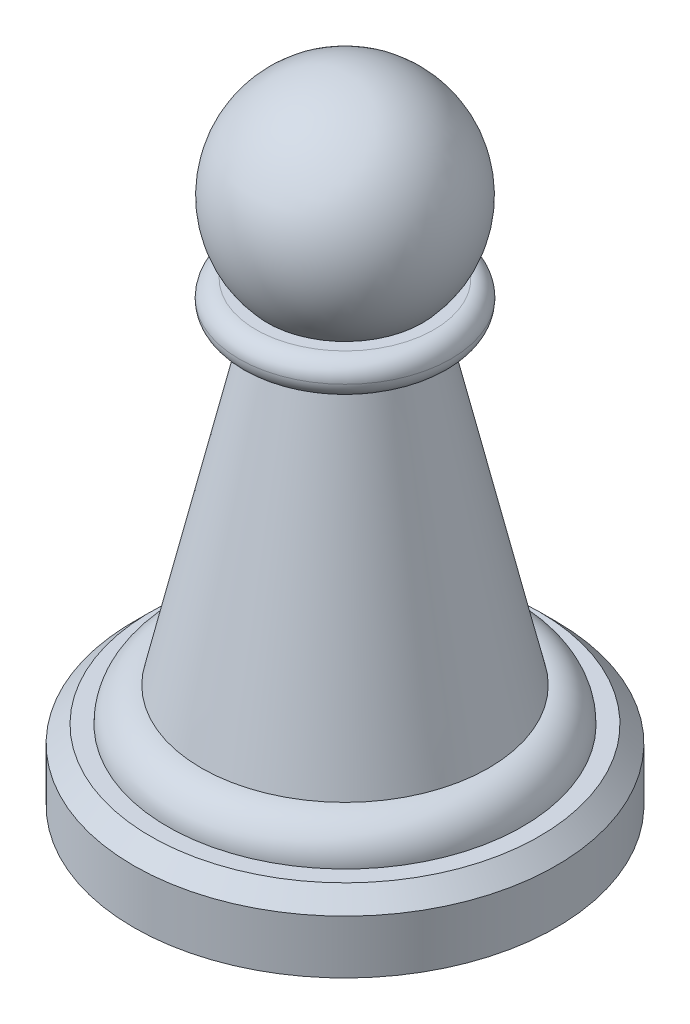
ISO-10303-21;
HEADER;
FILE_DESCRIPTION(('STEP AP214'),'2;1');
FILE_NAME('part.step','',(''),(''),'','','');
FILE_SCHEMA(('AUTOMOTIVE_DESIGN { 1 0 10303 214 1 1 1 1 }'));
ENDSEC;
DATA;
#1=APPLICATION_CONTEXT('core data for automotive mechanical design processes');
#2=APPLICATION_PROTOCOL_DEFINITION('international standard','automotive_design',2000,#1);
#3=PRODUCT_CONTEXT('',#1,'mechanical');
#4=PRODUCT('Part','Part','',(#3));
#5=PRODUCT_RELATED_PRODUCT_CATEGORY('part','',(#4));
#6=PRODUCT_DEFINITION_FORMATION('','',#4);
#7=PRODUCT_DEFINITION_CONTEXT('part definition',#1,'design');
#8=PRODUCT_DEFINITION('design','',#6,#7);
#9=PRODUCT_DEFINITION_SHAPE('','',#8);
#10=(LENGTH_UNIT() NAMED_UNIT(*) SI_UNIT(.MILLI.,.METRE.));
#11=(NAMED_UNIT(*) PLANE_ANGLE_UNIT() SI_UNIT($,.RADIAN.));
#12=(NAMED_UNIT(*) SI_UNIT($,.STERADIAN.) SOLID_ANGLE_UNIT());
#13=UNCERTAINTY_MEASURE_WITH_UNIT(LENGTH_MEASURE(1.E-05),#10,'distance_accuracy_value','');
#14=(GEOMETRIC_REPRESENTATION_CONTEXT(3) GLOBAL_UNCERTAINTY_ASSIGNED_CONTEXT((#13)) GLOBAL_UNIT_ASSIGNED_CONTEXT((#10,
#11,#12)) REPRESENTATION_CONTEXT('',''));
#15=CARTESIAN_POINT('',(0.,0.,0.));
#16=DIRECTION('',(0.,0.,1.));
#17=DIRECTION('',(1.,0.,0.));
#18=AXIS2_PLACEMENT_3D('',#15,#16,#17);
#19=CARTESIAN_POINT('',(0.,23.8125,0.));
#20=DIRECTION('',(0.,-1.,0.));
#21=DIRECTION('',(1.,0.,0.));
#22=AXIS2_PLACEMENT_3D('',#19,#20,#21);
#23=SPHERICAL_SURFACE('',#22,4.7625);
#24=CARTESIAN_POINT('',(0.,20.574,0.));
#25=DIRECTION('',(0.,-1.,0.));
#26=DIRECTION('',(0.,0.,-1.));
#27=AXIS2_PLACEMENT_3D('',#24,#25,#26);
#28=CIRCLE('',#27,3.49192267955635);
#29=CARTESIAN_POINT('',(0.,20.574,-3.49192267955635));
#30=VERTEX_POINT('',#29);
#31=EDGE_CURVE('E53',#30,#30,#28,.T.);
#32=ORIENTED_EDGE('',*,*,#31,.F.);
#33=EDGE_LOOP('',(#32));
#34=FACE_BOUND('',#33,.T.);
#35=ADVANCED_FACE('F33',(#34),#23,.T.);
#36=CARTESIAN_POINT('',(-3.49192267955635,20.574,0.));
#37=DIRECTION('',(0.,-1.,0.));
#38=DIRECTION('',(0.,0.,-1.));
#39=AXIS2_PLACEMENT_3D('',#36,#37,#38);
#40=PLANE('',#39);
#41=CARTESIAN_POINT('',(0.,20.574,0.));
#42=DIRECTION('',(0.,-1.,0.));
#43=DIRECTION('',(0.,0.,-1.));
#44=AXIS2_PLACEMENT_3D('',#41,#42,#43);
#45=CIRCLE('',#44,4.0132);
#46=CARTESIAN_POINT('',(0.,20.574,-4.0132));
#47=VERTEX_POINT('',#46);
#48=EDGE_CURVE('E41',#47,#47,#45,.F.);
#49=ORIENTED_EDGE('',*,*,#48,.T.);
#50=EDGE_LOOP('',(#49));
#51=FACE_BOUND('',#50,.T.);
#52=ORIENTED_EDGE('',*,*,#31,.T.);
#53=EDGE_LOOP('',(#52));
#54=FACE_BOUND('',#53,.T.);
#55=ADVANCED_FACE('F86',(#51,#54),#40,.F.);
#56=CARTESIAN_POINT('',(-3.17500000000015,19.05,0.));
#57=DIRECTION('',(0.,1.,0.));
#58=DIRECTION('',(0.,0.,1.));
#59=AXIS2_PLACEMENT_3D('',#56,#57,#58);
#60=PLANE('',#59);
#61=CARTESIAN_POINT('',(0.,19.05,0.));
#62=DIRECTION('',(0.,1.,0.));
#63=DIRECTION('',(0.,0.,1.));
#64=AXIS2_PLACEMENT_3D('',#61,#62,#63);
#65=CIRCLE('',#64,4.0132);
#66=CARTESIAN_POINT('',(0.,19.05,4.0132));
#67=VERTEX_POINT('',#66);
#68=EDGE_CURVE('E10',#67,#67,#65,.F.);
#69=ORIENTED_EDGE('',*,*,#68,.T.);
#70=EDGE_LOOP('',(#69));
#71=FACE_BOUND('',#70,.T.);
#72=CARTESIAN_POINT('',(0.,19.05,0.));
#73=DIRECTION('',(0.,-1.,0.));
#74=DIRECTION('',(0.,0.,-1.));
#75=AXIS2_PLACEMENT_3D('',#72,#73,#74);
#76=CIRCLE('',#75,3.17500000000015);
#77=CARTESIAN_POINT('',(0.,19.05,-3.17500000000015));
#78=VERTEX_POINT('',#77);
#79=EDGE_CURVE('E56',#78,#78,#76,.T.);
#80=ORIENTED_EDGE('',*,*,#79,.F.);
#81=EDGE_LOOP('',(#80));
#82=FACE_BOUND('',#81,.T.);
#83=ADVANCED_FACE('F92',(#71,#82),#60,.F.);
#84=CARTESIAN_POINT('',(0.,19.05,0.));
#85=DIRECTION('',(0.,-1.,0.));
#86=DIRECTION('',(0.,0.,-1.));
#87=AXIS2_PLACEMENT_3D('',#84,#85,#86);
#88=CONICAL_SURFACE('',#87,3.17500000000015,0.226152435732792);
#89=CARTESIAN_POINT('',(0.,4.699,0.));
#90=DIRECTION('',(0.,-1.,0.));
#91=DIRECTION('',(0.,0.,-1.));
#92=AXIS2_PLACEMENT_3D('',#89,#90,#91);
#93=CIRCLE('',#92,6.477);
#94=CARTESIAN_POINT('',(0.,4.699,-6.477));
#95=VERTEX_POINT('',#94);
#96=EDGE_CURVE('E59',#95,#95,#93,.T.);
#97=ORIENTED_EDGE('',*,*,#96,.F.);
#98=EDGE_LOOP('',(#97));
#99=FACE_BOUND('',#98,.T.);
#100=ORIENTED_EDGE('',*,*,#79,.T.);
#101=EDGE_LOOP('',(#100));
#102=FACE_BOUND('',#101,.T.);
#103=ADVANCED_FACE('F120',(#99,#102),#88,.T.);
#104=CARTESIAN_POINT('',(-8.001,3.175,0.));
#105=DIRECTION('',(0.,-1.,0.));
#106=DIRECTION('',(0.,0.,-1.));
#107=AXIS2_PLACEMENT_3D('',#104,#105,#106);
#108=PLANE('',#107);
#109=CARTESIAN_POINT('',(0.,3.175,0.));
#110=DIRECTION('',(0.,-1.,0.));
#111=DIRECTION('',(0.,0.,-1.));
#112=AXIS2_PLACEMENT_3D('',#109,#110,#111);
#113=CIRCLE('',#112,8.763);
#114=CARTESIAN_POINT('',(0.,3.175,-8.763));
#115=VERTEX_POINT('',#114);
#116=EDGE_CURVE('E45',#115,#115,#113,.F.);
#117=ORIENTED_EDGE('',*,*,#116,.T.);
#118=EDGE_LOOP('',(#117));
#119=FACE_BOUND('',#118,.T.);
#120=CARTESIAN_POINT('',(0.,3.175,0.));
#121=DIRECTION('',(0.,-1.,0.));
#122=DIRECTION('',(0.,0.,-1.));
#123=AXIS2_PLACEMENT_3D('',#120,#121,#122);
#124=CIRCLE('',#123,8.001);
#125=CARTESIAN_POINT('',(0.,3.175,-8.001));
#126=VERTEX_POINT('',#125);
#127=EDGE_CURVE('E62',#126,#126,#124,.T.);
#128=ORIENTED_EDGE('',*,*,#127,.T.);
#129=EDGE_LOOP('',(#128));
#130=FACE_BOUND('',#129,.T.);
#131=ADVANCED_FACE('F115',(#119,#130),#108,.F.);
#132=CARTESIAN_POINT('',(0.,0.,0.));
#133=DIRECTION('',(0.,-1.,0.));
#134=DIRECTION('',(0.,0.,-1.));
#135=AXIS2_PLACEMENT_3D('',#132,#133,#134);
#136=CYLINDRICAL_SURFACE('',#135,9.525);
#137=CARTESIAN_POINT('',(0.,2.413,0.));
#138=DIRECTION('',(0.,-1.,0.));
#139=DIRECTION('',(0.,0.,-1.));
#140=AXIS2_PLACEMENT_3D('',#137,#138,#139);
#141=CIRCLE('',#140,9.525);
#142=CARTESIAN_POINT('',(0.,2.413,-9.525));
#143=VERTEX_POINT('',#142);
#144=EDGE_CURVE('E50',#143,#143,#141,.T.);
#145=ORIENTED_EDGE('',*,*,#144,.T.);
#146=EDGE_LOOP('',(#145));
#147=FACE_BOUND('',#146,.T.);
#148=CARTESIAN_POINT('',(0.,0.,0.));
#149=DIRECTION('',(0.,-1.,0.));
#150=DIRECTION('',(0.,0.,-1.));
#151=AXIS2_PLACEMENT_3D('',#148,#149,#150);
#152=CIRCLE('',#151,9.525);
#153=CARTESIAN_POINT('',(0.,0.,-9.525));
#154=VERTEX_POINT('',#153);
#155=EDGE_CURVE('E65',#154,#154,#152,.T.);
#156=ORIENTED_EDGE('',*,*,#155,.F.);
#157=EDGE_LOOP('',(#156));
#158=FACE_BOUND('',#157,.T.);
#159=ADVANCED_FACE('F107',(#147,#158),#136,.T.);
#160=CARTESIAN_POINT('',(0.,0.,0.));
#161=DIRECTION('',(0.,1.,0.));
#162=DIRECTION('',(0.,0.,1.));
#163=AXIS2_PLACEMENT_3D('',#160,#161,#162);
#164=PLANE('',#163);
#165=ORIENTED_EDGE('',*,*,#155,.T.);
#166=EDGE_LOOP('',(#165));
#167=FACE_BOUND('',#166,.T.);
#168=ADVANCED_FACE('F102',(#167),#164,.F.);
#169=CARTESIAN_POINT('',(0.,2.413,0.));
#170=DIRECTION('',(0.,-1.,0.));
#171=DIRECTION('',(0.,0.,-1.));
#172=AXIS2_PLACEMENT_3D('',#169,#170,#171);
#173=CONICAL_SURFACE('',#172,9.525,0.785398163397449);
#174=ORIENTED_EDGE('',*,*,#116,.F.);
#175=EDGE_LOOP('',(#174));
#176=FACE_BOUND('',#175,.T.);
#177=ORIENTED_EDGE('',*,*,#144,.F.);
#178=EDGE_LOOP('',(#177));
#179=FACE_BOUND('',#178,.T.);
#180=ADVANCED_FACE('F82',(#176,#179),#173,.T.);
#181=CARTESIAN_POINT('',(0.,3.175,0.));
#182=DIRECTION('',(0.,-1.,0.));
#183=DIRECTION('',(0.,0.,-1.));
#184=AXIS2_PLACEMENT_3D('',#181,#182,#183);
#185=TOROIDAL_SURFACE('',#184,6.477,1.524);
#186=ORIENTED_EDGE('',*,*,#96,.T.);
#187=EDGE_LOOP('',(#186));
#188=FACE_BOUND('',#187,.T.);
#189=ORIENTED_EDGE('',*,*,#127,.F.);
#190=EDGE_LOOP('',(#189));
#191=FACE_BOUND('',#190,.T.);
#192=ADVANCED_FACE('F75',(#188,#191),#185,.T.);
#193=CARTESIAN_POINT('',(0.,19.812,0.));
#194=DIRECTION('',(0.,1.,0.));
#195=DIRECTION('',(0.,0.,1.));
#196=AXIS2_PLACEMENT_3D('',#193,#194,#195);
#197=TOROIDAL_SURFACE('',#196,4.0132,0.762);
#198=ORIENTED_EDGE('',*,*,#68,.F.);
#199=EDGE_LOOP('',(#198));
#200=FACE_BOUND('',#199,.T.);
#201=CARTESIAN_POINT('',(0.,19.812,0.));
#202=DIRECTION('',(0.,1.,0.));
#203=DIRECTION('',(0.,0.,1.));
#204=AXIS2_PLACEMENT_3D('',#201,#202,#203);
#205=CIRCLE('',#204,4.7752);
#206=CARTESIAN_POINT('',(0.,19.812,4.7752));
#207=VERTEX_POINT('',#206);
#208=EDGE_CURVE('E37',#207,#207,#205,.T.);
#209=ORIENTED_EDGE('',*,*,#208,.F.);
#210=EDGE_LOOP('',(#209));
#211=FACE_BOUND('',#210,.T.);
#212=ADVANCED_FACE('F35',(#200,#211),#197,.T.);
#213=CARTESIAN_POINT('',(0.,19.812,0.));
#214=DIRECTION('',(0.,-1.,0.));
#215=DIRECTION('',(0.,0.,-1.));
#216=AXIS2_PLACEMENT_3D('',#213,#214,#215);
#217=TOROIDAL_SURFACE('',#216,4.0132,0.762);
#218=ORIENTED_EDGE('',*,*,#48,.F.);
#219=EDGE_LOOP('',(#218));
#220=FACE_BOUND('',#219,.T.);
#221=ORIENTED_EDGE('',*,*,#208,.T.);
#222=EDGE_LOOP('',(#221));
#223=FACE_BOUND('',#222,.T.);
#224=ADVANCED_FACE('F72',(#220,#223),#217,.T.);
#225=CLOSED_SHELL('',(#35,#55,#83,#103,#131,#159,#168,#180,#192,#212,#224));
#226=MANIFOLD_SOLID_BREP('B2',#225);
#227=ADVANCED_BREP_SHAPE_REPRESENTATION('',(#18,#226),#14);
#228=SHAPE_DEFINITION_REPRESENTATION(#9,#227);
ENDSEC;
END-ISO-10303-21;
